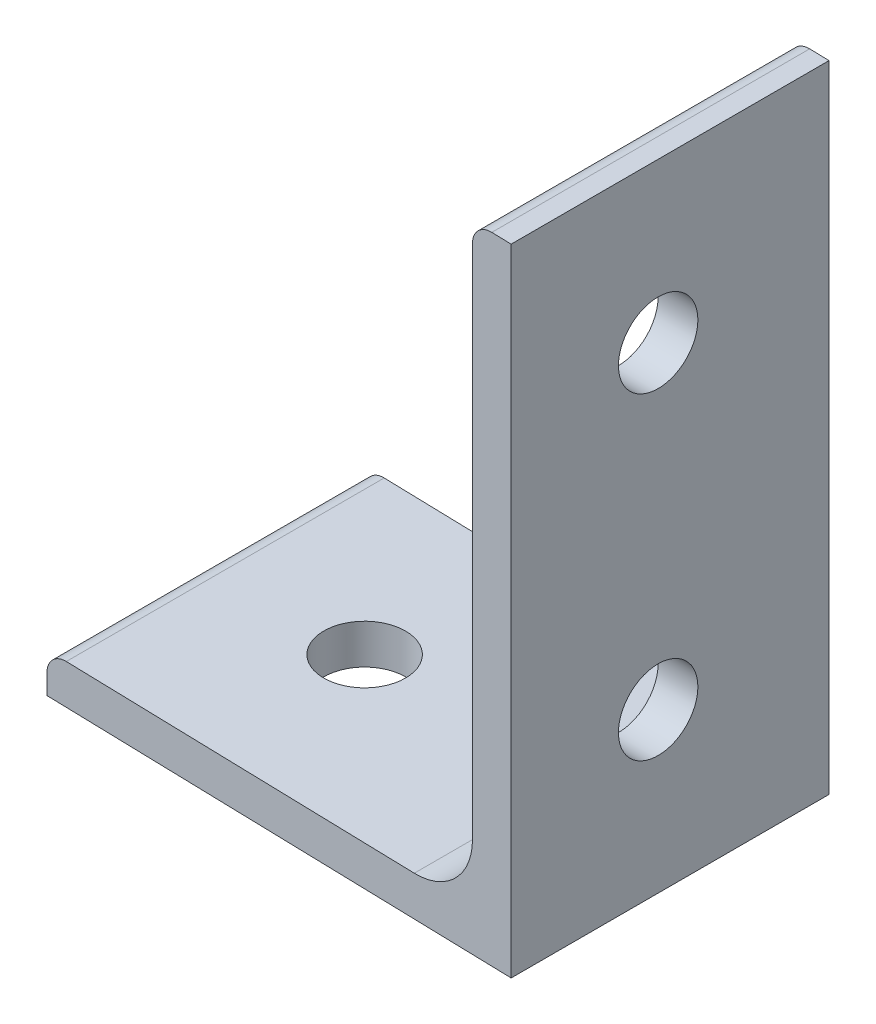
ISO-10303-21;
HEADER;
FILE_DESCRIPTION(('STEP AP214'),'2;1');
FILE_NAME('part.step','',(''),(''),'','','');
FILE_SCHEMA(('AUTOMOTIVE_DESIGN { 1 0 10303 214 1 1 1 1 }'));
ENDSEC;
DATA;
#1=APPLICATION_CONTEXT('core data for automotive mechanical design processes');
#2=APPLICATION_PROTOCOL_DEFINITION('international standard','automotive_design',2000,#1);
#3=PRODUCT_CONTEXT('',#1,'mechanical');
#4=PRODUCT('Part','Part','',(#3));
#5=PRODUCT_RELATED_PRODUCT_CATEGORY('part','',(#4));
#6=PRODUCT_DEFINITION_FORMATION('','',#4);
#7=PRODUCT_DEFINITION_CONTEXT('part definition',#1,'design');
#8=PRODUCT_DEFINITION('design','',#6,#7);
#9=PRODUCT_DEFINITION_SHAPE('','',#8);
#10=(LENGTH_UNIT() NAMED_UNIT(*) SI_UNIT(.MILLI.,.METRE.));
#11=(NAMED_UNIT(*) PLANE_ANGLE_UNIT() SI_UNIT($,.RADIAN.));
#12=(NAMED_UNIT(*) SI_UNIT($,.STERADIAN.) SOLID_ANGLE_UNIT());
#13=UNCERTAINTY_MEASURE_WITH_UNIT(LENGTH_MEASURE(1.E-05),#10,'distance_accuracy_value','');
#14=(GEOMETRIC_REPRESENTATION_CONTEXT(3) GLOBAL_UNCERTAINTY_ASSIGNED_CONTEXT((#13)) GLOBAL_UNIT_ASSIGNED_CONTEXT((#10,
#11,#12)) REPRESENTATION_CONTEXT('',''));
#15=CARTESIAN_POINT('',(0.,0.,0.));
#16=DIRECTION('',(0.,0.,1.));
#17=DIRECTION('',(1.,0.,0.));
#18=AXIS2_PLACEMENT_3D('',#15,#16,#17);
#19=CARTESIAN_POINT('',(11.0998,-17.4498,15.875));
#20=DIRECTION('',(0.,0.,-1.));
#21=DIRECTION('',(-1.,0.,0.));
#22=AXIS2_PLACEMENT_3D('',#19,#20,#21);
#23=CYLINDRICAL_SURFACE('',#22,4.7752);
#24=CARTESIAN_POINT('',(15.875,-17.4498,-1.03948691539076));
#25=CARTESIAN_POINT('',(15.8749607958703,-17.5857111678711,-0.88636728916195));
#26=CARTESIAN_POINT('',(15.8691996849909,-17.7140476477459,-0.726760117128143));
#27=CARTESIAN_POINT('',(15.8497967345363,-17.9544683584301,-0.396363679361274));
#28=CARTESIAN_POINT('',(15.8361614968117,-18.0665661058063,-0.22558388724293));
#29=CARTESIAN_POINT('',(15.8045617726995,-18.2736350085392,0.125622679980232));
#30=CARTESIAN_POINT('',(15.7865973860279,-18.3686065582862,0.306049232810688));
#31=CARTESIAN_POINT('',(15.7495425805541,-18.5407600045839,0.67510719331504));
#32=CARTESIAN_POINT('',(15.7304521193145,-18.6179412301489,0.863738910138651));
#33=CARTESIAN_POINT('',(15.6967691857035,-18.7436213817966,1.21871387387688));
#34=CARTESIAN_POINT('',(15.6819325225662,-18.7946903479383,1.38412925764113));
#35=CARTESIAN_POINT('',(15.6550238870502,-18.8831929373582,1.71878250282254));
#36=CARTESIAN_POINT('',(15.6429515643681,-18.9206282886737,1.88801987691916));
#37=CARTESIAN_POINT('',(15.6227910942342,-18.9815035505426,2.22888818713434));
#38=CARTESIAN_POINT('',(15.61469514375,-19.0049708905553,2.40051375031946));
#39=CARTESIAN_POINT('',(15.6032507410658,-19.0378086575615,2.74527476590421));
#40=CARTESIAN_POINT('',(15.5999023688349,-19.0471788470998,2.91841024368774));
#41=CARTESIAN_POINT('',(15.5982853959638,-19.0517270775053,3.26489147188662));
#42=CARTESIAN_POINT('',(15.6000167809953,-19.046905158404,3.43823722170747));
#43=CARTESIAN_POINT('',(15.6083875972335,-19.0231181320052,3.78383492012362));
#44=CARTESIAN_POINT('',(15.6150271156843,-19.0041527733028,3.95608684922095));
#45=CARTESIAN_POINT('',(15.6325736391906,-18.9522138991968,4.29855382341782));
#46=CARTESIAN_POINT('',(15.6434882697233,-18.9192153438454,4.4687646656111));
#47=CARTESIAN_POINT('',(15.6685023777956,-18.8394888602921,4.8056891970083));
#48=CARTESIAN_POINT('',(15.6826017995377,-18.7927611726205,4.97240294742541));
#49=CARTESIAN_POINT('',(15.7124527944421,-18.6863262194501,5.30005157526771));
#50=CARTESIAN_POINT('',(15.7281908781162,-18.6267211685287,5.46102094842186));
#51=CARTESIAN_POINT('',(15.7597762892197,-18.494674394576,5.77762774560287));
#52=CARTESIAN_POINT('',(15.775623634243,-18.4222305554551,5.933264285618));
#53=CARTESIAN_POINT('',(15.8055620041383,-18.2651029571149,6.23791277229174));
#54=CARTESIAN_POINT('',(15.8196573049611,-18.1804501317333,6.38694025260411));
#55=CARTESIAN_POINT('',(15.844163346169,-17.9992544101473,6.6778173767018));
#56=CARTESIAN_POINT('',(15.8545764055647,-17.9027190491873,6.81967148972664));
#57=CARTESIAN_POINT('',(15.8661705537528,-17.7452906054384,7.03196140991059));
#58=CARTESIAN_POINT('',(15.8693951869497,-17.6883913450767,7.10527508787163));
#59=CARTESIAN_POINT('',(15.8738086580742,-17.5714388928702,7.24933281503493));
#60=CARTESIAN_POINT('',(15.8749986832437,-17.5113875614351,7.3200783392082));
#61=CARTESIAN_POINT('',(15.875,-17.4498,7.38948691539076));
#62=B_SPLINE_CURVE_WITH_KNOTS('',3,(#24,#25,#26,#27,#28,#29,#30,#31,#32,#33,#34,#35,#36,#37,#38,
#39,#40,#41,#42,#43,#44,#45,#46,#47,#48,#49,#50,#51,#52,#53,#54,#55,#56,#57,#58,#59,#60,#61),
.UNSPECIFIED.,.F.,.F.,(4,2,2,2,2,2,2,2,2,2,2,2,2,2,2,2,2,2,4),(0.,0.613649372772356,
1.22678499311274,1.83990649206568,2.45305111192113,2.97374489222339,3.4943726524897,
4.01397463607018,4.53358537183239,5.05319464193575,5.57281314850678,6.09336274560457,
6.61390322337106,7.13045448971822,7.64709097337797,8.16244073380393,8.67746535559927,
8.95594344265792,9.23425897565638),.UNSPECIFIED.);
#63=CARTESIAN_POINT('',(15.875,-17.4498,-1.03948691539076));
#64=VERTEX_POINT('',#63);
#65=CARTESIAN_POINT('',(15.875,-17.4498,7.38948691539076));
#66=VERTEX_POINT('',#65);
#67=EDGE_CURVE('E12',#64,#66,#62,.T.);
#68=ORIENTED_EDGE('',*,*,#67,.F.);
#69=DIRECTION('',(0.,0.,-1.));
#70=VECTOR('',#69,1.);
#71=CARTESIAN_POINT('',(15.875,-17.4498,15.875));
#72=LINE('',#71,#70);
#73=CARTESIAN_POINT('',(15.875,-17.4498,-10.5673287924405));
#74=VERTEX_POINT('',#73);
#75=EDGE_CURVE('E135',#64,#74,#72,.T.);
#76=ORIENTED_EDGE('',*,*,#75,.T.);
#77=CARTESIAN_POINT('',(11.0998,-17.4498,-10.6923718051183));
#78=DIRECTION('',(0.0261769483079951,0.,-0.999657324975554));
#79=DIRECTION('',(-0.999657324975554,0.,-0.0261769483079951));
#80=AXIS2_PLACEMENT_3D('',#77,#78,#79);
#81=ELLIPSE('',#80,4.77683690270241,4.7752);
#82=CARTESIAN_POINT('',(11.0998,-22.225,-10.6923718051183));
#83=VERTEX_POINT('',#82);
#84=EDGE_CURVE('E202',#83,#74,#81,.F.);
#85=ORIENTED_EDGE('',*,*,#84,.F.);
#86=DIRECTION('',(0.,0.,-1.));
#87=VECTOR('',#86,1.);
#88=CARTESIAN_POINT('',(11.0998,-22.225,15.875));
#89=LINE('',#88,#87);
#90=CARTESIAN_POINT('',(11.0998,-22.225,14.7163351241499));
#91=VERTEX_POINT('',#90);
#92=EDGE_CURVE('E145',#91,#83,#89,.T.);
#93=ORIENTED_EDGE('',*,*,#92,.F.);
#94=CARTESIAN_POINT('',(11.0998,-17.4498,14.7163351241499));
#95=DIRECTION('',(-0.0261769483079953,0.,0.999657324975554));
#96=DIRECTION('',(-0.999657324975554,0.,-0.0261769483079953));
#97=AXIS2_PLACEMENT_3D('',#94,#95,#96);
#98=ELLIPSE('',#97,4.77683690270241,4.7752);
#99=CARTESIAN_POINT('',(15.875,-17.4498,14.8413781368276));
#100=VERTEX_POINT('',#99);
#101=EDGE_CURVE('E229',#100,#91,#98,.F.);
#102=ORIENTED_EDGE('',*,*,#101,.F.);
#103=EDGE_CURVE('E138',#100,#66,#72,.T.);
#104=ORIENTED_EDGE('',*,*,#103,.T.);
#105=EDGE_LOOP('',(#68,#76,#85,#93,#102,#104));
#106=FACE_BOUND('',#105,.T.);
#107=ADVANCED_FACE('F45',(#106),#23,.F.);
#108=CARTESIAN_POINT('',(-19.05,-23.8125,15.875));
#109=DIRECTION('',(1.,0.,0.));
#110=DIRECTION('',(0.,0.,-1.));
#111=AXIS2_PLACEMENT_3D('',#108,#109,#110);
#112=PLANE('',#111);
#113=DIRECTION('',(0.,-1.,0.));
#114=VECTOR('',#113,1.);
#115=CARTESIAN_POINT('',(-19.05,25.4,-11.4818721032486));
#116=LINE('',#115,#114);
#117=CARTESIAN_POINT('',(-19.05,-23.8125,-11.4818721032486));
#118=VERTEX_POINT('',#117);
#119=CARTESIAN_POINT('',(-19.05,-25.4,-11.4818721032486));
#120=VERTEX_POINT('',#119);
#121=EDGE_CURVE('E192',#118,#120,#116,.T.);
#122=ORIENTED_EDGE('',*,*,#121,.T.);
#123=DIRECTION('',(0.,0.,-1.));
#124=VECTOR('',#123,1.);
#125=CARTESIAN_POINT('',(-19.05,-25.4,15.875));
#126=LINE('',#125,#124);
#127=CARTESIAN_POINT('',(-19.05,-25.4,13.9268348260195));
#128=VERTEX_POINT('',#127);
#129=EDGE_CURVE('E169',#128,#120,#126,.T.);
#130=ORIENTED_EDGE('',*,*,#129,.F.);
#131=DIRECTION('',(0.,-1.,0.));
#132=VECTOR('',#131,1.);
#133=CARTESIAN_POINT('',(-19.05,25.4,13.9268348260195));
#134=LINE('',#133,#132);
#135=CARTESIAN_POINT('',(-19.05,-23.8125,13.9268348260195));
#136=VERTEX_POINT('',#135);
#137=EDGE_CURVE('E242',#136,#128,#134,.T.);
#138=ORIENTED_EDGE('',*,*,#137,.F.);
#139=DIRECTION('',(0.,0.,-1.));
#140=VECTOR('',#139,1.);
#141=CARTESIAN_POINT('',(-19.05,-23.8125,15.875));
#142=LINE('',#141,#140);
#143=EDGE_CURVE('E183',#136,#118,#142,.T.);
#144=ORIENTED_EDGE('',*,*,#143,.T.);
#145=EDGE_LOOP('',(#122,#130,#138,#144));
#146=FACE_BOUND('',#145,.T.);
#147=ADVANCED_FACE('F47',(#146),#112,.F.);
#148=CARTESIAN_POINT('',(-19.05,-25.4,15.875));
#149=DIRECTION('',(0.,1.,0.));
#150=DIRECTION('',(-1.,0.,0.));
#151=AXIS2_PLACEMENT_3D('',#148,#149,#150);
#152=PLANE('',#151);
#153=CARTESIAN_POINT('',(-6.02190472930852,-25.4,1.56363455034174));
#154=DIRECTION('',(0.,-1.,0.));
#155=DIRECTION('',(0.,0.,-1.));
#156=AXIS2_PLACEMENT_3D('',#153,#154,#155);
#157=CIRCLE('',#156,3.26389999999999);
#158=CARTESIAN_POINT('',(-6.02190472930852,-25.4,-1.70026544965824));
#159=VERTEX_POINT('',#158);
#160=EDGE_CURVE('E131',#159,#159,#157,.T.);
#161=ORIENTED_EDGE('',*,*,#160,.F.);
#162=EDGE_LOOP('',(#161));
#163=FACE_BOUND('',#162,.T.);
#164=DIRECTION('',(0.999657324975554,0.,0.0261769483079951));
#165=VECTOR('',#164,1.);
#166=CARTESIAN_POINT('',(-19.05,-25.4,-11.4818721032486));
#167=LINE('',#166,#165);
#168=CARTESIAN_POINT('',(19.05,-25.4,-10.484188491458));
#169=VERTEX_POINT('',#168);
#170=EDGE_CURVE('E252',#120,#169,#167,.T.);
#171=ORIENTED_EDGE('',*,*,#170,.T.);
#172=DIRECTION('',(0.,0.,-1.));
#173=VECTOR('',#172,1.);
#174=CARTESIAN_POINT('',(19.05,-25.4,15.875));
#175=LINE('',#174,#173);
#176=CARTESIAN_POINT('',(19.05,-25.4,14.9245184378102));
#177=VERTEX_POINT('',#176);
#178=EDGE_CURVE('E165',#177,#169,#175,.T.);
#179=ORIENTED_EDGE('',*,*,#178,.F.);
#180=DIRECTION('',(-0.999657324975554,0.,-0.0261769483079953));
#181=VECTOR('',#180,1.);
#182=CARTESIAN_POINT('',(-19.05,-25.4,13.9268348260195));
#183=LINE('',#182,#181);
#184=EDGE_CURVE('E247',#177,#128,#183,.T.);
#185=ORIENTED_EDGE('',*,*,#184,.T.);
#186=ORIENTED_EDGE('',*,*,#129,.T.);
#187=EDGE_LOOP('',(#171,#179,#185,#186));
#188=FACE_BOUND('',#187,.T.);
#189=ADVANCED_FACE('F271',(#163,#188),#152,.F.);
#190=CARTESIAN_POINT('',(19.05,-25.4,15.875));
#191=DIRECTION('',(-1.,0.,0.));
#192=DIRECTION('',(0.,-1.,0.));
#193=AXIS2_PLACEMENT_3D('',#190,#191,#192);
#194=PLANE('',#193);
#195=CARTESIAN_POINT('',(19.05,12.7,3.175));
#196=DIRECTION('',(1.,0.,0.));
#197=DIRECTION('',(0.,1.,0.));
#198=AXIS2_PLACEMENT_3D('',#195,#196,#197);
#199=CIRCLE('',#198,3.175);
#200=CARTESIAN_POINT('',(19.05,15.875,3.175));
#201=VERTEX_POINT('',#200);
#202=EDGE_CURVE('E179',#201,#201,#199,.T.);
#203=ORIENTED_EDGE('',*,*,#202,.F.);
#204=EDGE_LOOP('',(#203));
#205=FACE_BOUND('',#204,.T.);
#206=CARTESIAN_POINT('',(19.05,-12.7,3.175));
#207=DIRECTION('',(1.,0.,0.));
#208=DIRECTION('',(0.,1.,0.));
#209=AXIS2_PLACEMENT_3D('',#206,#207,#208);
#210=CIRCLE('',#209,3.175);
#211=CARTESIAN_POINT('',(19.05,-9.525,3.175));
#212=VERTEX_POINT('',#211);
#213=EDGE_CURVE('E210',#212,#212,#210,.T.);
#214=ORIENTED_EDGE('',*,*,#213,.F.);
#215=EDGE_LOOP('',(#214));
#216=FACE_BOUND('',#215,.T.);
#217=DIRECTION('',(0.,-1.,0.));
#218=VECTOR('',#217,1.);
#219=CARTESIAN_POINT('',(19.05,25.4,-10.484188491458));
#220=LINE('',#219,#218);
#221=CARTESIAN_POINT('',(19.05,25.4,-10.484188491458));
#222=VERTEX_POINT('',#221);
#223=EDGE_CURVE('E234',#222,#169,#220,.T.);
#224=ORIENTED_EDGE('',*,*,#223,.F.);
#225=DIRECTION('',(0.,0.,-1.));
#226=VECTOR('',#225,1.);
#227=CARTESIAN_POINT('',(19.05,25.4,15.875));
#228=LINE('',#227,#226);
#229=CARTESIAN_POINT('',(19.05,25.4,14.9245184378102));
#230=VERTEX_POINT('',#229);
#231=EDGE_CURVE('E161',#230,#222,#228,.T.);
#232=ORIENTED_EDGE('',*,*,#231,.F.);
#233=DIRECTION('',(0.,-1.,0.));
#234=VECTOR('',#233,1.);
#235=CARTESIAN_POINT('',(19.05,25.4,14.9245184378102));
#236=LINE('',#235,#234);
#237=EDGE_CURVE('E237',#230,#177,#236,.T.);
#238=ORIENTED_EDGE('',*,*,#237,.T.);
#239=ORIENTED_EDGE('',*,*,#178,.T.);
#240=EDGE_LOOP('',(#224,#232,#238,#239));
#241=FACE_BOUND('',#240,.T.);
#242=ADVANCED_FACE('F274',(#205,#216,#241),#194,.F.);
#243=CARTESIAN_POINT('',(17.4625,25.4,15.875));
#244=DIRECTION('',(0.,-1.,0.));
#245=DIRECTION('',(1.,0.,0.));
#246=AXIS2_PLACEMENT_3D('',#243,#244,#245);
#247=PLANE('',#246);
#248=DIRECTION('',(0.999657324975554,0.,0.0261769483079951));
#249=VECTOR('',#248,1.);
#250=CARTESIAN_POINT('',(-19.05,25.4,-11.4818721032486));
#251=LINE('',#250,#249);
#252=CARTESIAN_POINT('',(17.4625,25.4,-10.5257586419492));
#253=VERTEX_POINT('',#252);
#254=EDGE_CURVE('E251',#253,#222,#251,.T.);
#255=ORIENTED_EDGE('',*,*,#254,.F.);
#256=DIRECTION('',(0.,0.,-1.));
#257=VECTOR('',#256,1.);
#258=CARTESIAN_POINT('',(17.4625,25.4,15.875));
#259=LINE('',#258,#257);
#260=CARTESIAN_POINT('',(17.4625,25.4,14.8829482873189));
#261=VERTEX_POINT('',#260);
#262=EDGE_CURVE('E157',#261,#253,#259,.T.);
#263=ORIENTED_EDGE('',*,*,#262,.F.);
#264=DIRECTION('',(-0.999657324975554,0.,-0.0261769483079953));
#265=VECTOR('',#264,1.);
#266=CARTESIAN_POINT('',(-19.05,25.4,13.9268348260195));
#267=LINE('',#266,#265);
#268=EDGE_CURVE('E238',#230,#261,#267,.T.);
#269=ORIENTED_EDGE('',*,*,#268,.F.);
#270=ORIENTED_EDGE('',*,*,#231,.T.);
#271=EDGE_LOOP('',(#255,#263,#269,#270));
#272=FACE_BOUND('',#271,.T.);
#273=ADVANCED_FACE('F286',(#272),#247,.F.);
#274=CARTESIAN_POINT('',(17.4625,23.8125,15.875));
#275=DIRECTION('',(0.,0.,-1.));
#276=DIRECTION('',(-1.,0.,0.));
#277=AXIS2_PLACEMENT_3D('',#274,#275,#276);
#278=CYLINDRICAL_SURFACE('',#277,1.5875);
#279=CARTESIAN_POINT('',(17.4625,23.8125,-10.5257586419492));
#280=DIRECTION('',(0.0261769483079951,0.,-0.999657324975554));
#281=DIRECTION('',(-0.999657324975554,0.,-0.0261769483079951));
#282=AXIS2_PLACEMENT_3D('',#279,#280,#281);
#283=ELLIPSE('',#282,1.58804418307925,1.5875);
#284=CARTESIAN_POINT('',(15.875,23.8125,-10.5673287924405));
#285=VERTEX_POINT('',#284);
#286=EDGE_CURVE('E214',#285,#253,#283,.T.);
#287=ORIENTED_EDGE('',*,*,#286,.F.);
#288=DIRECTION('',(0.,0.,-1.));
#289=VECTOR('',#288,1.);
#290=CARTESIAN_POINT('',(15.875,23.8125,15.875));
#291=LINE('',#290,#289);
#292=CARTESIAN_POINT('',(15.875,23.8125,14.8413781368276));
#293=VERTEX_POINT('',#292);
#294=EDGE_CURVE('E149',#293,#285,#291,.T.);
#295=ORIENTED_EDGE('',*,*,#294,.F.);
#296=CARTESIAN_POINT('',(17.4625,23.8125,14.8829482873189));
#297=DIRECTION('',(-0.0261769483079953,0.,0.999657324975554));
#298=DIRECTION('',(-0.999657324975554,0.,-0.0261769483079953));
#299=AXIS2_PLACEMENT_3D('',#296,#297,#298);
#300=ELLIPSE('',#299,1.58804418307925,1.5875);
#301=EDGE_CURVE('E203',#261,#293,#300,.T.);
#302=ORIENTED_EDGE('',*,*,#301,.F.);
#303=ORIENTED_EDGE('',*,*,#262,.T.);
#304=EDGE_LOOP('',(#287,#295,#302,#303));
#305=FACE_BOUND('',#304,.T.);
#306=ADVANCED_FACE('F289',(#305),#278,.T.);
#307=CARTESIAN_POINT('',(15.875,23.8125,15.875));
#308=DIRECTION('',(1.,0.,0.));
#309=DIRECTION('',(0.,1.,0.));
#310=AXIS2_PLACEMENT_3D('',#307,#308,#309);
#311=PLANE('',#310);
#312=ORIENTED_EDGE('',*,*,#75,.F.);
#313=CARTESIAN_POINT('',(15.875,-12.7,3.175));
#314=DIRECTION('',(-1.,0.,0.));
#315=DIRECTION('',(0.,-1.,0.));
#316=AXIS2_PLACEMENT_3D('',#313,#314,#315);
#317=CIRCLE('',#316,6.35);
#318=EDGE_CURVE('E67',#64,#66,#317,.T.);
#319=ORIENTED_EDGE('',*,*,#318,.T.);
#320=ORIENTED_EDGE('',*,*,#103,.F.);
#321=DIRECTION('',(0.,-1.,0.));
#322=VECTOR('',#321,1.);
#323=CARTESIAN_POINT('',(15.875,23.8125,14.8413781368276));
#324=LINE('',#323,#322);
#325=EDGE_CURVE('E226',#293,#100,#324,.T.);
#326=ORIENTED_EDGE('',*,*,#325,.F.);
#327=ORIENTED_EDGE('',*,*,#294,.T.);
#328=DIRECTION('',(0.,1.,0.));
#329=VECTOR('',#328,1.);
#330=CARTESIAN_POINT('',(15.875,23.8125,-10.5673287924405));
#331=LINE('',#330,#329);
#332=EDGE_CURVE('E143',#74,#285,#331,.T.);
#333=ORIENTED_EDGE('',*,*,#332,.F.);
#334=EDGE_LOOP('',(#312,#319,#320,#326,#327,#333));
#335=FACE_BOUND('',#334,.T.);
#336=CARTESIAN_POINT('',(15.875,12.7,3.175));
#337=DIRECTION('',(1.,0.,0.));
#338=DIRECTION('',(0.,1.,0.));
#339=AXIS2_PLACEMENT_3D('',#336,#337,#338);
#340=CIRCLE('',#339,3.175);
#341=CARTESIAN_POINT('',(15.875,15.875,3.175));
#342=VERTEX_POINT('',#341);
#343=EDGE_CURVE('E178',#342,#342,#340,.T.);
#344=ORIENTED_EDGE('',*,*,#343,.T.);
#345=EDGE_LOOP('',(#344));
#346=FACE_BOUND('',#345,.T.);
#347=CARTESIAN_POINT('',(15.875,-12.7,3.175));
#348=DIRECTION('',(1.,0.,0.));
#349=DIRECTION('',(0.,1.,0.));
#350=AXIS2_PLACEMENT_3D('',#347,#348,#349);
#351=CIRCLE('',#350,3.175);
#352=CARTESIAN_POINT('',(15.875,-9.525,3.175));
#353=VERTEX_POINT('',#352);
#354=EDGE_CURVE('E174',#353,#353,#351,.T.);
#355=ORIENTED_EDGE('',*,*,#354,.T.);
#356=EDGE_LOOP('',(#355));
#357=FACE_BOUND('',#356,.T.);
#358=ADVANCED_FACE('F140',(#335,#346,#357),#311,.F.);
#359=CARTESIAN_POINT('',(11.0998,-22.225,15.875));
#360=DIRECTION('',(0.,-1.,0.));
#361=DIRECTION('',(1.,0.,0.));
#362=AXIS2_PLACEMENT_3D('',#359,#360,#361);
#363=PLANE('',#362);
#364=CARTESIAN_POINT('',(-6.02190472930852,-22.225,1.56363455034174));
#365=DIRECTION('',(0.,-1.,0.));
#366=DIRECTION('',(1.,0.,0.));
#367=AXIS2_PLACEMENT_3D('',#364,#365,#366);
#368=CIRCLE('',#367,3.26389999999999);
#369=CARTESIAN_POINT('',(-2.75800472930853,-22.225,1.56363455034174));
#370=VERTEX_POINT('',#369);
#371=EDGE_CURVE('E256',#370,#370,#368,.T.);
#372=ORIENTED_EDGE('',*,*,#371,.T.);
#373=EDGE_LOOP('',(#372));
#374=FACE_BOUND('',#373,.T.);
#375=DIRECTION('',(0.999657324975554,0.,0.0261769483079951));
#376=VECTOR('',#375,1.);
#377=CARTESIAN_POINT('',(11.7950144041446,-22.225,-10.6741669752575));
#378=LINE('',#377,#376);
#379=CARTESIAN_POINT('',(-17.4625,-22.225,-11.4403019527573));
#380=VERTEX_POINT('',#379);
#381=EDGE_CURVE('E190',#380,#83,#378,.T.);
#382=ORIENTED_EDGE('',*,*,#381,.F.);
#383=DIRECTION('',(0.,0.,-1.));
#384=VECTOR('',#383,1.);
#385=CARTESIAN_POINT('',(-17.4625,-22.225,15.875));
#386=LINE('',#385,#384);
#387=CARTESIAN_POINT('',(-17.4625,-22.225,13.9684049765108));
#388=VERTEX_POINT('',#387);
#389=EDGE_CURVE('E151',#388,#380,#386,.T.);
#390=ORIENTED_EDGE('',*,*,#389,.F.);
#391=DIRECTION('',(-0.999657324975554,0.,-0.0261769483079953));
#392=VECTOR('',#391,1.);
#393=CARTESIAN_POINT('',(11.1301199171215,-22.225,14.7171290791216));
#394=LINE('',#393,#392);
#395=EDGE_CURVE('E74',#91,#388,#394,.T.);
#396=ORIENTED_EDGE('',*,*,#395,.F.);
#397=ORIENTED_EDGE('',*,*,#92,.T.);
#398=EDGE_LOOP('',(#382,#390,#396,#397));
#399=FACE_BOUND('',#398,.T.);
#400=ADVANCED_FACE('F199',(#374,#399),#363,.F.);
#401=CARTESIAN_POINT('',(-17.4625,-23.8125,15.875));
#402=DIRECTION('',(0.,0.,-1.));
#403=DIRECTION('',(-1.,0.,0.));
#404=AXIS2_PLACEMENT_3D('',#401,#402,#403);
#405=CYLINDRICAL_SURFACE('',#404,1.5875);
#406=CARTESIAN_POINT('',(-17.4625,-23.8125,-11.4403019527573));
#407=DIRECTION('',(0.0261769483079951,0.,-0.999657324975554));
#408=DIRECTION('',(-0.999657324975554,0.,-0.0261769483079951));
#409=AXIS2_PLACEMENT_3D('',#406,#407,#408);
#410=ELLIPSE('',#409,1.58804418307926,1.5875);
#411=EDGE_CURVE('E60',#118,#380,#410,.T.);
#412=ORIENTED_EDGE('',*,*,#411,.F.);
#413=ORIENTED_EDGE('',*,*,#143,.F.);
#414=CARTESIAN_POINT('',(-17.4625,-23.8125,13.9684049765108));
#415=DIRECTION('',(-0.0261769483079953,0.,0.999657324975554));
#416=DIRECTION('',(-0.999657324975554,0.,-0.0261769483079953));
#417=AXIS2_PLACEMENT_3D('',#414,#415,#416);
#418=ELLIPSE('',#417,1.58804418307926,1.5875);
#419=EDGE_CURVE('E173',#388,#136,#418,.T.);
#420=ORIENTED_EDGE('',*,*,#419,.F.);
#421=ORIENTED_EDGE('',*,*,#389,.T.);
#422=EDGE_LOOP('',(#412,#413,#420,#421));
#423=FACE_BOUND('',#422,.T.);
#424=ADVANCED_FACE('F205',(#423),#405,.T.);
#425=CARTESIAN_POINT('',(-19.05,-12.7,3.175));
#426=DIRECTION('',(1.,0.,0.));
#427=DIRECTION('',(0.,1.,0.));
#428=AXIS2_PLACEMENT_3D('',#425,#426,#427);
#429=CYLINDRICAL_SURFACE('',#428,3.175);
#430=CARTESIAN_POINT('',(19.05,-9.525,3.175));
#431=CARTESIAN_POINT('',(19.0169270833333,-9.525,3.175));
#432=CARTESIAN_POINT('',(18.9838541666667,-9.525,3.175));
#433=CARTESIAN_POINT('',(18.9177083333333,-9.525,3.175));
#434=CARTESIAN_POINT('',(18.8846354166667,-9.525,3.175));
#435=CARTESIAN_POINT('',(18.8184895833333,-9.525,3.175));
#436=CARTESIAN_POINT('',(18.7854166666667,-9.525,3.175));
#437=CARTESIAN_POINT('',(18.7192708333333,-9.525,3.175));
#438=CARTESIAN_POINT('',(18.6861979166667,-9.525,3.175));
#439=CARTESIAN_POINT('',(18.6200520833333,-9.525,3.175));
#440=CARTESIAN_POINT('',(18.5869791666667,-9.525,3.175));
#441=CARTESIAN_POINT('',(18.5208333333333,-9.525,3.175));
#442=CARTESIAN_POINT('',(18.4877604166667,-9.525,3.175));
#443=CARTESIAN_POINT('',(18.4216145833333,-9.525,3.175));
#444=CARTESIAN_POINT('',(18.3885416666667,-9.525,3.175));
#445=CARTESIAN_POINT('',(18.3223958333333,-9.525,3.175));
#446=CARTESIAN_POINT('',(18.2893229166667,-9.525,3.175));
#447=CARTESIAN_POINT('',(18.2231770833333,-9.525,3.175));
#448=CARTESIAN_POINT('',(18.1901041666667,-9.525,3.175));
#449=CARTESIAN_POINT('',(18.1239583333333,-9.525,3.175));
#450=CARTESIAN_POINT('',(18.0908854166667,-9.525,3.175));
#451=CARTESIAN_POINT('',(18.0247395833333,-9.525,3.175));
#452=CARTESIAN_POINT('',(17.9916666666667,-9.525,3.175));
#453=CARTESIAN_POINT('',(17.9255208333333,-9.525,3.175));
#454=CARTESIAN_POINT('',(17.8924479166667,-9.525,3.175));
#455=CARTESIAN_POINT('',(17.8263020833333,-9.525,3.175));
#456=CARTESIAN_POINT('',(17.7932291666667,-9.525,3.175));
#457=CARTESIAN_POINT('',(17.7270833333333,-9.525,3.175));
#458=CARTESIAN_POINT('',(17.6940104166667,-9.525,3.175));
#459=CARTESIAN_POINT('',(17.6278645833333,-9.525,3.175));
#460=CARTESIAN_POINT('',(17.5947916666667,-9.525,3.175));
#461=CARTESIAN_POINT('',(17.5286458333333,-9.525,3.175));
#462=CARTESIAN_POINT('',(17.4955729166667,-9.525,3.175));
#463=CARTESIAN_POINT('',(17.4294270833333,-9.525,3.175));
#464=CARTESIAN_POINT('',(17.3963541666667,-9.525,3.175));
#465=CARTESIAN_POINT('',(17.3302083333333,-9.525,3.175));
#466=CARTESIAN_POINT('',(17.2971354166667,-9.525,3.175));
#467=CARTESIAN_POINT('',(17.2309895833333,-9.525,3.175));
#468=CARTESIAN_POINT('',(17.1979166666667,-9.525,3.175));
#469=CARTESIAN_POINT('',(17.1317708333333,-9.525,3.175));
#470=CARTESIAN_POINT('',(17.0986979166667,-9.525,3.175));
#471=CARTESIAN_POINT('',(17.0325520833333,-9.525,3.175));
#472=CARTESIAN_POINT('',(16.9994791666667,-9.525,3.175));
#473=CARTESIAN_POINT('',(16.9333333333333,-9.525,3.175));
#474=CARTESIAN_POINT('',(16.9002604166667,-9.525,3.175));
#475=CARTESIAN_POINT('',(16.8341145833333,-9.525,3.175));
#476=CARTESIAN_POINT('',(16.8010416666667,-9.525,3.175));
#477=CARTESIAN_POINT('',(16.7348958333333,-9.525,3.175));
#478=CARTESIAN_POINT('',(16.7018229166667,-9.525,3.175));
#479=CARTESIAN_POINT('',(16.6356770833333,-9.525,3.175));
#480=CARTESIAN_POINT('',(16.6026041666667,-9.525,3.175));
#481=CARTESIAN_POINT('',(16.5364583333333,-9.525,3.175));
#482=CARTESIAN_POINT('',(16.5033854166667,-9.525,3.175));
#483=CARTESIAN_POINT('',(16.4372395833333,-9.525,3.175));
#484=CARTESIAN_POINT('',(16.4041666666667,-9.525,3.175));
#485=CARTESIAN_POINT('',(16.3380208333333,-9.525,3.175));
#486=CARTESIAN_POINT('',(16.3049479166667,-9.525,3.175));
#487=CARTESIAN_POINT('',(16.2388020833333,-9.525,3.175));
#488=CARTESIAN_POINT('',(16.2057291666667,-9.525,3.175));
#489=CARTESIAN_POINT('',(16.1395833333333,-9.525,3.175));
#490=CARTESIAN_POINT('',(16.1065104166667,-9.525,3.175));
#491=CARTESIAN_POINT('',(16.0403645833333,-9.525,3.175));
#492=CARTESIAN_POINT('',(16.0072916666667,-9.525,3.175));
#493=CARTESIAN_POINT('',(15.9411458333333,-9.525,3.175));
#494=CARTESIAN_POINT('',(15.9080729166667,-9.525,3.175));
#495=CARTESIAN_POINT('',(15.875,-9.525,3.175));
#496=B_SPLINE_CURVE_WITH_KNOTS('',3,(#430,#431,#432,#433,#434,#435,#436,#437,#438,#439,#440,
#441,#442,#443,#444,#445,#446,#447,#448,#449,#450,#451,#452,#453,#454,#455,#456,#457,#458,#459,
#460,#461,#462,#463,#464,#465,#466,#467,#468,#469,#470,#471,#472,#473,#474,#475,#476,#477,#478,
#479,#480,#481,#482,#483,#484,#485,#486,#487,#488,#489,#490,#491,#492,#493,#494,#495),
.UNSPECIFIED.,.F.,.F.,(4,2,2,2,2,2,2,2,2,2,2,2,2,2,2,2,2,2,2,2,2,2,2,2,2,2,2,2,2,2,2,2,4),(0.,
0.0992187499999977,0.198437500000002,0.29765625,0.396875000000005,0.496093750000003,0.5953125,
0.694531250000005,0.793750000000003,0.892968750000001,0.992187500000005,1.09140625,1.190625,
1.28984375000001,1.3890625,1.48828125000001,1.58750000000001,1.68671875,1.78593750000001,
1.88515625000001,1.98437500000001,2.08359375000001,2.18281250000001,2.28203125000001,
2.38125000000001,2.48046875000001,2.57968750000001,2.67890625000001,2.77812500000001,
2.87734375000001,2.97656250000001,3.07578125000001,3.17500000000001),.UNSPECIFIED.);
#497=EDGE_CURVE('BSEAM314',#212,#353,#496,.T.);
#498=ORIENTED_EDGE('',*,*,#213,.T.);
#499=ORIENTED_EDGE('',*,*,#354,.F.);
#500=ORIENTED_EDGE('',*,*,#497,.T.);
#501=ORIENTED_EDGE('',*,*,#497,.F.);
#502=EDGE_LOOP('',(#498,#500,#499,#501));
#503=FACE_BOUND('',#502,.T.);
#504=ADVANCED_FACE('F314',(#503),#429,.F.);
#505=CARTESIAN_POINT('',(-19.05,12.7,3.175));
#506=DIRECTION('',(1.,0.,0.));
#507=DIRECTION('',(0.,1.,0.));
#508=AXIS2_PLACEMENT_3D('',#505,#506,#507);
#509=CYLINDRICAL_SURFACE('',#508,3.175);
#510=CARTESIAN_POINT('',(19.05,15.875,3.175));
#511=CARTESIAN_POINT('',(19.0169270833333,15.875,3.175));
#512=CARTESIAN_POINT('',(18.9838541666667,15.875,3.175));
#513=CARTESIAN_POINT('',(18.9177083333333,15.875,3.175));
#514=CARTESIAN_POINT('',(18.8846354166667,15.875,3.175));
#515=CARTESIAN_POINT('',(18.8184895833333,15.875,3.175));
#516=CARTESIAN_POINT('',(18.7854166666667,15.875,3.175));
#517=CARTESIAN_POINT('',(18.7192708333333,15.875,3.175));
#518=CARTESIAN_POINT('',(18.6861979166667,15.875,3.175));
#519=CARTESIAN_POINT('',(18.6200520833333,15.875,3.175));
#520=CARTESIAN_POINT('',(18.5869791666667,15.875,3.175));
#521=CARTESIAN_POINT('',(18.5208333333333,15.875,3.175));
#522=CARTESIAN_POINT('',(18.4877604166667,15.875,3.175));
#523=CARTESIAN_POINT('',(18.4216145833333,15.875,3.175));
#524=CARTESIAN_POINT('',(18.3885416666667,15.875,3.175));
#525=CARTESIAN_POINT('',(18.3223958333333,15.875,3.175));
#526=CARTESIAN_POINT('',(18.2893229166667,15.875,3.175));
#527=CARTESIAN_POINT('',(18.2231770833333,15.875,3.175));
#528=CARTESIAN_POINT('',(18.1901041666667,15.875,3.175));
#529=CARTESIAN_POINT('',(18.1239583333333,15.875,3.175));
#530=CARTESIAN_POINT('',(18.0908854166667,15.875,3.175));
#531=CARTESIAN_POINT('',(18.0247395833333,15.875,3.175));
#532=CARTESIAN_POINT('',(17.9916666666667,15.875,3.175));
#533=CARTESIAN_POINT('',(17.9255208333333,15.875,3.175));
#534=CARTESIAN_POINT('',(17.8924479166667,15.875,3.175));
#535=CARTESIAN_POINT('',(17.8263020833333,15.875,3.175));
#536=CARTESIAN_POINT('',(17.7932291666667,15.875,3.175));
#537=CARTESIAN_POINT('',(17.7270833333333,15.875,3.175));
#538=CARTESIAN_POINT('',(17.6940104166667,15.875,3.175));
#539=CARTESIAN_POINT('',(17.6278645833333,15.875,3.175));
#540=CARTESIAN_POINT('',(17.5947916666667,15.875,3.175));
#541=CARTESIAN_POINT('',(17.5286458333333,15.875,3.175));
#542=CARTESIAN_POINT('',(17.4955729166667,15.875,3.175));
#543=CARTESIAN_POINT('',(17.4294270833333,15.875,3.175));
#544=CARTESIAN_POINT('',(17.3963541666667,15.875,3.175));
#545=CARTESIAN_POINT('',(17.3302083333333,15.875,3.175));
#546=CARTESIAN_POINT('',(17.2971354166667,15.875,3.175));
#547=CARTESIAN_POINT('',(17.2309895833333,15.875,3.175));
#548=CARTESIAN_POINT('',(17.1979166666667,15.875,3.175));
#549=CARTESIAN_POINT('',(17.1317708333333,15.875,3.175));
#550=CARTESIAN_POINT('',(17.0986979166667,15.875,3.175));
#551=CARTESIAN_POINT('',(17.0325520833333,15.875,3.175));
#552=CARTESIAN_POINT('',(16.9994791666667,15.875,3.175));
#553=CARTESIAN_POINT('',(16.9333333333333,15.875,3.175));
#554=CARTESIAN_POINT('',(16.9002604166667,15.875,3.175));
#555=CARTESIAN_POINT('',(16.8341145833333,15.875,3.175));
#556=CARTESIAN_POINT('',(16.8010416666667,15.875,3.175));
#557=CARTESIAN_POINT('',(16.7348958333333,15.875,3.175));
#558=CARTESIAN_POINT('',(16.7018229166667,15.875,3.175));
#559=CARTESIAN_POINT('',(16.6356770833333,15.875,3.175));
#560=CARTESIAN_POINT('',(16.6026041666667,15.875,3.175));
#561=CARTESIAN_POINT('',(16.5364583333333,15.875,3.175));
#562=CARTESIAN_POINT('',(16.5033854166667,15.875,3.175));
#563=CARTESIAN_POINT('',(16.4372395833333,15.875,3.175));
#564=CARTESIAN_POINT('',(16.4041666666667,15.875,3.175));
#565=CARTESIAN_POINT('',(16.3380208333333,15.875,3.175));
#566=CARTESIAN_POINT('',(16.3049479166667,15.875,3.175));
#567=CARTESIAN_POINT('',(16.2388020833333,15.875,3.175));
#568=CARTESIAN_POINT('',(16.2057291666667,15.875,3.175));
#569=CARTESIAN_POINT('',(16.1395833333333,15.875,3.175));
#570=CARTESIAN_POINT('',(16.1065104166667,15.875,3.175));
#571=CARTESIAN_POINT('',(16.0403645833333,15.875,3.175));
#572=CARTESIAN_POINT('',(16.0072916666667,15.875,3.175));
#573=CARTESIAN_POINT('',(15.9411458333333,15.875,3.175));
#574=CARTESIAN_POINT('',(15.9080729166667,15.875,3.175));
#575=CARTESIAN_POINT('',(15.875,15.875,3.175));
#576=B_SPLINE_CURVE_WITH_KNOTS('',3,(#510,#511,#512,#513,#514,#515,#516,#517,#518,#519,#520,
#521,#522,#523,#524,#525,#526,#527,#528,#529,#530,#531,#532,#533,#534,#535,#536,#537,#538,#539,
#540,#541,#542,#543,#544,#545,#546,#547,#548,#549,#550,#551,#552,#553,#554,#555,#556,#557,#558,
#559,#560,#561,#562,#563,#564,#565,#566,#567,#568,#569,#570,#571,#572,#573,#574,#575),
.UNSPECIFIED.,.F.,.F.,(4,2,2,2,2,2,2,2,2,2,2,2,2,2,2,2,2,2,2,2,2,2,2,2,2,2,2,2,2,2,2,2,4),(0.,
0.0992187499999977,0.198437500000002,0.29765625,0.396874999999998,0.496093750000003,0.5953125,
0.694531249999998,0.793749999999996,0.892968750000001,0.992187499999998,1.09140625,1.190625,
1.28984375,1.3890625,1.48828125,1.5875,1.68671875,1.7859375,1.88515625,1.984375,2.08359375,
2.1828125,2.28203125,2.38125,2.48046875,2.5796875,2.67890624999999,2.778125,2.87734375,
2.97656249999999,3.07578125,3.175),.UNSPECIFIED.);
#577=EDGE_CURVE('BSEAM317',#201,#342,#576,.T.);
#578=ORIENTED_EDGE('',*,*,#202,.T.);
#579=ORIENTED_EDGE('',*,*,#343,.F.);
#580=ORIENTED_EDGE('',*,*,#577,.T.);
#581=ORIENTED_EDGE('',*,*,#577,.F.);
#582=EDGE_LOOP('',(#578,#580,#579,#581));
#583=FACE_BOUND('',#582,.T.);
#584=ADVANCED_FACE('F317',(#583),#509,.F.);
#585=CARTESIAN_POINT('',(-19.05,25.4,13.9268348260195));
#586=DIRECTION('',(-0.0261769483079953,0.,0.999657324975554));
#587=DIRECTION('',(0.999657324975554,0.,0.0261769483079953));
#588=AXIS2_PLACEMENT_3D('',#585,#586,#587);
#589=PLANE('',#588);
#590=ORIENTED_EDGE('',*,*,#301,.T.);
#591=ORIENTED_EDGE('',*,*,#325,.T.);
#592=ORIENTED_EDGE('',*,*,#101,.T.);
#593=ORIENTED_EDGE('',*,*,#395,.T.);
#594=ORIENTED_EDGE('',*,*,#419,.T.);
#595=ORIENTED_EDGE('',*,*,#137,.T.);
#596=ORIENTED_EDGE('',*,*,#184,.F.);
#597=ORIENTED_EDGE('',*,*,#237,.F.);
#598=ORIENTED_EDGE('',*,*,#268,.T.);
#599=EDGE_LOOP('',(#590,#591,#592,#593,#594,#595,#596,#597,#598));
#600=FACE_BOUND('',#599,.T.);
#601=ADVANCED_FACE('F281',(#600),#589,.T.);
#602=CARTESIAN_POINT('',(-19.05,25.4,-11.4818721032486));
#603=DIRECTION('',(0.0261769483079951,0.,-0.999657324975554));
#604=DIRECTION('',(-0.999657324975554,0.,-0.0261769483079951));
#605=AXIS2_PLACEMENT_3D('',#602,#603,#604);
#606=PLANE('',#605);
#607=ORIENTED_EDGE('',*,*,#286,.T.);
#608=ORIENTED_EDGE('',*,*,#254,.T.);
#609=ORIENTED_EDGE('',*,*,#223,.T.);
#610=ORIENTED_EDGE('',*,*,#170,.F.);
#611=ORIENTED_EDGE('',*,*,#121,.F.);
#612=ORIENTED_EDGE('',*,*,#411,.T.);
#613=ORIENTED_EDGE('',*,*,#381,.T.);
#614=ORIENTED_EDGE('',*,*,#84,.T.);
#615=ORIENTED_EDGE('',*,*,#332,.T.);
#616=EDGE_LOOP('',(#607,#608,#609,#610,#611,#612,#613,#614,#615));
#617=FACE_BOUND('',#616,.T.);
#618=ADVANCED_FACE('F189',(#617),#606,.T.);
#619=CARTESIAN_POINT('',(-6.02190472930852,-25.4,1.56363455034174));
#620=DIRECTION('',(0.,-1.,0.));
#621=DIRECTION('',(0.,0.,-1.));
#622=AXIS2_PLACEMENT_3D('',#619,#620,#621);
#623=CYLINDRICAL_SURFACE('',#622,3.26389999999999);
#624=ORIENTED_EDGE('',*,*,#160,.T.);
#625=EDGE_LOOP('',(#624));
#626=FACE_BOUND('',#625,.T.);
#627=ORIENTED_EDGE('',*,*,#371,.F.);
#628=EDGE_LOOP('',(#627));
#629=FACE_BOUND('',#628,.T.);
#630=ADVANCED_FACE('F268',(#626,#629),#623,.F.);
#631=CARTESIAN_POINT('',(13.335,-12.7,3.175));
#632=DIRECTION('',(1.,0.,0.));
#633=DIRECTION('',(0.,1.,0.));
#634=AXIS2_PLACEMENT_3D('',#631,#632,#633);
#635=CYLINDRICAL_SURFACE('',#634,6.35);
#636=ORIENTED_EDGE('',*,*,#67,.T.);
#637=ORIENTED_EDGE('',*,*,#318,.F.);
#638=EDGE_LOOP('',(#636,#637));
#639=FACE_BOUND('',#638,.T.);
#640=ADVANCED_FACE('F128',(#639),#635,.F.);
#641=CLOSED_SHELL('',(#107,#147,#189,#242,#273,#306,#358,#400,#424,#504,#584,#601,#618,#630,#640));
#642=MANIFOLD_SOLID_BREP('B2',#641);
#643=ADVANCED_BREP_SHAPE_REPRESENTATION('',(#18,#642),#14);
#644=SHAPE_DEFINITION_REPRESENTATION(#9,#643);
ENDSEC;
END-ISO-10303-21;
